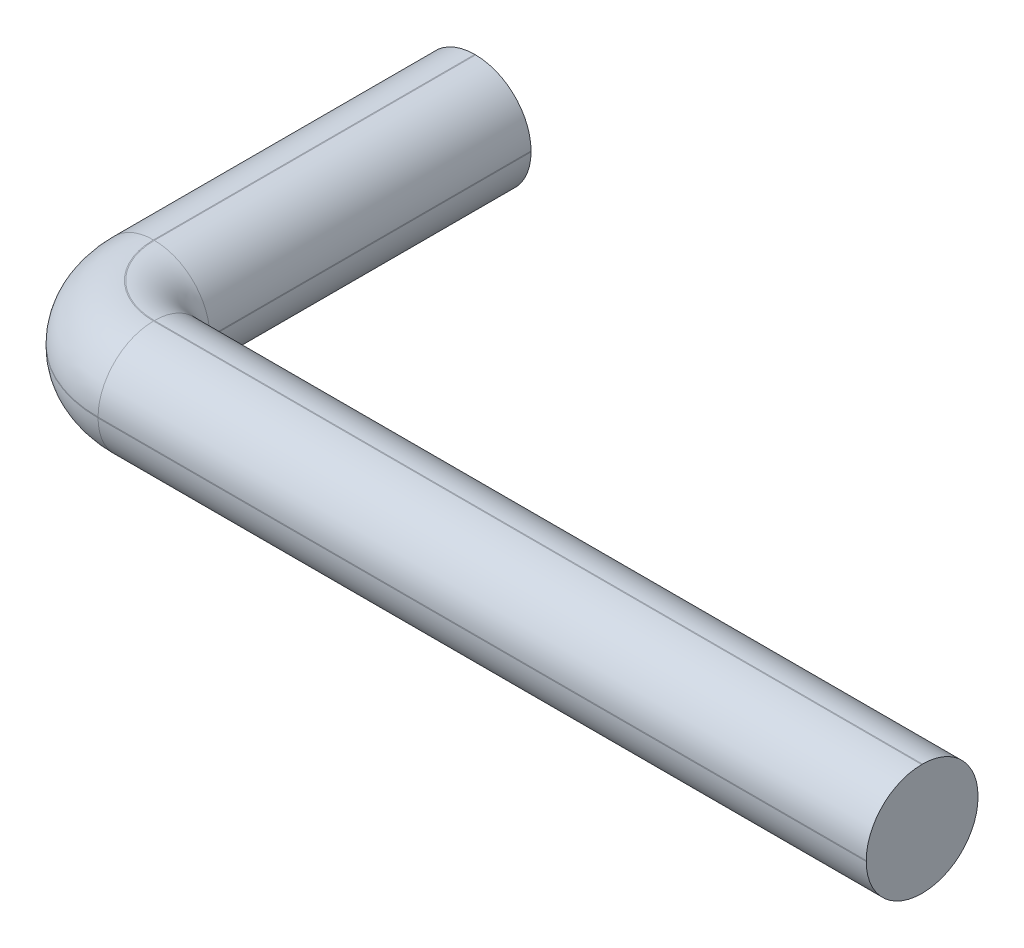
ISO-10303-21;
HEADER;
FILE_DESCRIPTION(('STEP AP214'),'2;1');
FILE_NAME('part.step','',(''),(''),'','','');
FILE_SCHEMA(('AUTOMOTIVE_DESIGN { 1 0 10303 214 1 1 1 1 }'));
ENDSEC;
DATA;
#1=APPLICATION_CONTEXT('core data for automotive mechanical design processes');
#2=APPLICATION_PROTOCOL_DEFINITION('international standard','automotive_design',2000,#1);
#3=PRODUCT_CONTEXT('',#1,'mechanical');
#4=PRODUCT('Part','Part','',(#3));
#5=PRODUCT_RELATED_PRODUCT_CATEGORY('part','',(#4));
#6=PRODUCT_DEFINITION_FORMATION('','',#4);
#7=PRODUCT_DEFINITION_CONTEXT('part definition',#1,'design');
#8=PRODUCT_DEFINITION('design','',#6,#7);
#9=PRODUCT_DEFINITION_SHAPE('','',#8);
#10=(LENGTH_UNIT() NAMED_UNIT(*) SI_UNIT(.MILLI.,.METRE.));
#11=(NAMED_UNIT(*) PLANE_ANGLE_UNIT() SI_UNIT($,.RADIAN.));
#12=(NAMED_UNIT(*) SI_UNIT($,.STERADIAN.) SOLID_ANGLE_UNIT());
#13=UNCERTAINTY_MEASURE_WITH_UNIT(LENGTH_MEASURE(1.E-05),#10,'distance_accuracy_value','');
#14=(GEOMETRIC_REPRESENTATION_CONTEXT(3) GLOBAL_UNCERTAINTY_ASSIGNED_CONTEXT((#13)) GLOBAL_UNIT_ASSIGNED_CONTEXT((#10,
#11,#12)) REPRESENTATION_CONTEXT('',''));
#15=CARTESIAN_POINT('',(0.,0.,0.));
#16=DIRECTION('',(0.,0.,1.));
#17=DIRECTION('',(1.,0.,0.));
#18=AXIS2_PLACEMENT_3D('',#15,#16,#17);
#19=CARTESIAN_POINT('',(3.1496,3.2004,0.));
#20=DIRECTION('',(0.,0.,1.));
#21=DIRECTION('',(1.,0.,0.));
#22=AXIS2_PLACEMENT_3D('',#19,#20,#21);
#23=CYLINDRICAL_SURFACE('',#22,3.1496);
#24=CARTESIAN_POINT('',(3.1496,3.2004,-7.14375));
#25=DIRECTION('',(0.,0.,-1.));
#26=DIRECTION('',(-1.,0.,0.));
#27=AXIS2_PLACEMENT_3D('',#24,#25,#26);
#28=CIRCLE('',#27,3.1496);
#29=CARTESIAN_POINT('',(3.1496,6.35,-7.14375));
#30=VERTEX_POINT('',#29);
#31=CARTESIAN_POINT('',(0.,3.2004,-7.14375));
#32=VERTEX_POINT('',#31);
#33=EDGE_CURVE('E170',#30,#32,#28,.F.);
#34=ORIENTED_EDGE('',*,*,#33,.F.);
#35=DIRECTION('',(0.,0.,-1.));
#36=VECTOR('',#35,1.);
#37=CARTESIAN_POINT('',(3.1496,6.35,0.));
#38=LINE('',#37,#36);
#39=CARTESIAN_POINT('',(3.1496,6.35,-25.4));
#40=VERTEX_POINT('',#39);
#41=EDGE_CURVE('E227',#30,#40,#38,.T.);
#42=ORIENTED_EDGE('',*,*,#41,.T.);
#43=CARTESIAN_POINT('',(3.1496,3.2004,-25.4));
#44=DIRECTION('',(0.,0.,1.));
#45=DIRECTION('',(1.,0.,0.));
#46=AXIS2_PLACEMENT_3D('',#43,#44,#45);
#47=CIRCLE('',#46,3.1496);
#48=CARTESIAN_POINT('',(0.,3.2004,-25.4));
#49=VERTEX_POINT('',#48);
#50=EDGE_CURVE('E166',#40,#49,#47,.T.);
#51=ORIENTED_EDGE('',*,*,#50,.T.);
#52=DIRECTION('',(0.,0.,-1.));
#53=VECTOR('',#52,1.);
#54=CARTESIAN_POINT('',(0.,3.2004,0.));
#55=LINE('',#54,#53);
#56=EDGE_CURVE('E150',#49,#32,#55,.F.);
#57=ORIENTED_EDGE('',*,*,#56,.T.);
#58=EDGE_LOOP('',(#34,#42,#51,#57));
#59=FACE_BOUND('',#58,.T.);
#60=ADVANCED_FACE('F17',(#59),#23,.T.);
#61=CARTESIAN_POINT('',(3.2004,3.2004,0.));
#62=DIRECTION('',(0.,0.,-1.));
#63=DIRECTION('',(-1.,0.,0.));
#64=AXIS2_PLACEMENT_3D('',#61,#62,#63);
#65=CYLINDRICAL_SURFACE('',#64,3.1496);
#66=CARTESIAN_POINT('',(3.2004,3.2004,-25.4));
#67=DIRECTION('',(0.,0.,-1.));
#68=DIRECTION('',(-1.,0.,0.));
#69=AXIS2_PLACEMENT_3D('',#66,#67,#68);
#70=CIRCLE('',#69,3.1496);
#71=CARTESIAN_POINT('',(6.35,3.2004,-25.4));
#72=VERTEX_POINT('',#71);
#73=CARTESIAN_POINT('',(3.2004,6.35,-25.4));
#74=VERTEX_POINT('',#73);
#75=EDGE_CURVE('E20',#72,#74,#70,.F.);
#76=ORIENTED_EDGE('',*,*,#75,.T.);
#77=DIRECTION('',(0.,0.,-1.));
#78=VECTOR('',#77,1.);
#79=CARTESIAN_POINT('',(3.2004,6.35,0.));
#80=LINE('',#79,#78);
#81=CARTESIAN_POINT('',(3.2004,6.35,-7.14375));
#82=VERTEX_POINT('',#81);
#83=EDGE_CURVE('E233',#74,#82,#80,.F.);
#84=ORIENTED_EDGE('',*,*,#83,.T.);
#85=CARTESIAN_POINT('',(3.2004,3.2004,-7.14375));
#86=DIRECTION('',(0.,0.,-1.));
#87=DIRECTION('',(-1.,0.,0.));
#88=AXIS2_PLACEMENT_3D('',#85,#86,#87);
#89=CIRCLE('',#88,3.1496);
#90=CARTESIAN_POINT('',(6.35,3.2004,-7.14375));
#91=VERTEX_POINT('',#90);
#92=EDGE_CURVE('E133',#91,#82,#89,.F.);
#93=ORIENTED_EDGE('',*,*,#92,.F.);
#94=DIRECTION('',(0.,0.,1.));
#95=VECTOR('',#94,1.);
#96=CARTESIAN_POINT('',(6.35,3.2004,-25.4));
#97=LINE('',#96,#95);
#98=EDGE_CURVE('E128',#91,#72,#97,.F.);
#99=ORIENTED_EDGE('',*,*,#98,.T.);
#100=EDGE_LOOP('',(#76,#84,#93,#99));
#101=FACE_BOUND('',#100,.T.);
#102=ADVANCED_FACE('F130',(#101),#65,.T.);
#103=CARTESIAN_POINT('',(7.14375,3.2004,-7.14375));
#104=DIRECTION('',(0.,-1.,0.));
#105=DIRECTION('',(0.,0.,-1.));
#106=AXIS2_PLACEMENT_3D('',#103,#104,#105);
#107=TOROIDAL_SURFACE('',#106,3.94335,3.1496);
#108=ORIENTED_EDGE('',*,*,#92,.T.);
#109=CARTESIAN_POINT('',(7.14375,6.35,-7.14375));
#110=DIRECTION('',(0.,1.,0.));
#111=DIRECTION('',(-1.,0.,0.));
#112=AXIS2_PLACEMENT_3D('',#109,#110,#111);
#113=CIRCLE('',#112,3.94335);
#114=CARTESIAN_POINT('',(7.14375,6.35,-3.2004));
#115=VERTEX_POINT('',#114);
#116=EDGE_CURVE('E200',#82,#115,#113,.T.);
#117=ORIENTED_EDGE('',*,*,#116,.T.);
#118=CARTESIAN_POINT('',(7.14375,3.2004,-3.2004));
#119=DIRECTION('',(-1.,0.,0.));
#120=DIRECTION('',(0.,0.,1.));
#121=AXIS2_PLACEMENT_3D('',#118,#119,#120);
#122=CIRCLE('',#121,3.1496);
#123=CARTESIAN_POINT('',(7.14375,3.2004,-6.35));
#124=VERTEX_POINT('',#123);
#125=EDGE_CURVE('E237',#124,#115,#122,.F.);
#126=ORIENTED_EDGE('',*,*,#125,.F.);
#127=CARTESIAN_POINT('',(7.14375,3.2004,-7.14375));
#128=DIRECTION('',(0.,1.,0.));
#129=DIRECTION('',(0.,0.,1.));
#130=AXIS2_PLACEMENT_3D('',#127,#128,#129);
#131=CIRCLE('',#130,0.79375);
#132=EDGE_CURVE('E155',#124,#91,#131,.F.);
#133=ORIENTED_EDGE('',*,*,#132,.T.);
#134=EDGE_LOOP('',(#108,#117,#126,#133));
#135=FACE_BOUND('',#134,.T.);
#136=ADVANCED_FACE('F207',(#135),#107,.T.);
#137=CARTESIAN_POINT('',(0.,6.35,0.));
#138=DIRECTION('',(0.,-1.,0.));
#139=DIRECTION('',(0.,0.,-1.));
#140=AXIS2_PLACEMENT_3D('',#137,#138,#139);
#141=PLANE('',#140);
#142=ORIENTED_EDGE('',*,*,#83,.F.);
#143=DIRECTION('',(1.,0.,0.));
#144=VECTOR('',#143,1.);
#145=CARTESIAN_POINT('',(0.,6.35,-25.4));
#146=LINE('',#145,#144);
#147=EDGE_CURVE('E149',#74,#40,#146,.F.);
#148=ORIENTED_EDGE('',*,*,#147,.T.);
#149=ORIENTED_EDGE('',*,*,#41,.F.);
#150=CARTESIAN_POINT('',(7.14375,6.35,-7.14375));
#151=DIRECTION('',(0.,-1.,0.));
#152=DIRECTION('',(0.,0.,1.));
#153=AXIS2_PLACEMENT_3D('',#150,#151,#152);
#154=CIRCLE('',#153,3.99415);
#155=CARTESIAN_POINT('',(7.14375,6.35,-3.1496));
#156=VERTEX_POINT('',#155);
#157=EDGE_CURVE('E300',#156,#30,#154,.T.);
#158=ORIENTED_EDGE('',*,*,#157,.F.);
#159=DIRECTION('',(1.,0.,0.));
#160=VECTOR('',#159,1.);
#161=CARTESIAN_POINT('',(0.,6.35,-3.1496));
#162=LINE('',#161,#160);
#163=CARTESIAN_POINT('',(50.8,6.35,-3.1496));
#164=VERTEX_POINT('',#163);
#165=EDGE_CURVE('E257',#164,#156,#162,.F.);
#166=ORIENTED_EDGE('',*,*,#165,.F.);
#167=DIRECTION('',(0.,0.,-1.));
#168=VECTOR('',#167,1.);
#169=CARTESIAN_POINT('',(50.8,6.35,0.));
#170=LINE('',#169,#168);
#171=CARTESIAN_POINT('',(50.8,6.35,-3.2004));
#172=VERTEX_POINT('',#171);
#173=EDGE_CURVE('E225',#172,#164,#170,.F.);
#174=ORIENTED_EDGE('',*,*,#173,.F.);
#175=DIRECTION('',(-1.,0.,0.));
#176=VECTOR('',#175,1.);
#177=CARTESIAN_POINT('',(0.,6.35,-3.2004));
#178=LINE('',#177,#176);
#179=EDGE_CURVE('E239',#115,#172,#178,.F.);
#180=ORIENTED_EDGE('',*,*,#179,.F.);
#181=ORIENTED_EDGE('',*,*,#116,.F.);
#182=EDGE_LOOP('',(#142,#148,#149,#158,#166,#174,#180,#181));
#183=FACE_BOUND('',#182,.T.);
#184=ADVANCED_FACE('F179',(#183),#141,.F.);
#185=CARTESIAN_POINT('',(7.14375,3.2004,-7.14375));
#186=DIRECTION('',(0.,-1.,0.));
#187=DIRECTION('',(0.,0.,-1.));
#188=AXIS2_PLACEMENT_3D('',#185,#186,#187);
#189=TOROIDAL_SURFACE('',#188,3.99415,3.1496);
#190=CARTESIAN_POINT('',(7.14375,3.2004,-3.1496));
#191=DIRECTION('',(1.,0.,0.));
#192=DIRECTION('',(0.,0.,-1.));
#193=AXIS2_PLACEMENT_3D('',#190,#191,#192);
#194=CIRCLE('',#193,3.1496);
#195=CARTESIAN_POINT('',(7.14375,3.2004,0.));
#196=VERTEX_POINT('',#195);
#197=EDGE_CURVE('E244',#156,#196,#194,.T.);
#198=ORIENTED_EDGE('',*,*,#197,.F.);
#199=ORIENTED_EDGE('',*,*,#157,.T.);
#200=ORIENTED_EDGE('',*,*,#33,.T.);
#201=CARTESIAN_POINT('',(7.14375,3.2004,-7.14375));
#202=DIRECTION('',(0.,-1.,0.));
#203=DIRECTION('',(0.,0.,-1.));
#204=AXIS2_PLACEMENT_3D('',#201,#202,#203);
#205=CIRCLE('',#204,7.14375);
#206=EDGE_CURVE('E291',#196,#32,#205,.T.);
#207=ORIENTED_EDGE('',*,*,#206,.F.);
#208=EDGE_LOOP('',(#198,#199,#200,#207));
#209=FACE_BOUND('',#208,.T.);
#210=ADVANCED_FACE('F173',(#209),#189,.T.);
#211=CARTESIAN_POINT('',(0.,6.35,0.));
#212=DIRECTION('',(1.,0.,0.));
#213=DIRECTION('',(0.,0.,-1.));
#214=AXIS2_PLACEMENT_3D('',#211,#212,#213);
#215=PLANE('',#214);
#216=DIRECTION('',(0.,0.,-1.));
#217=VECTOR('',#216,1.);
#218=CARTESIAN_POINT('',(0.,3.1496,0.));
#219=LINE('',#218,#217);
#220=CARTESIAN_POINT('',(0.,3.1496,-7.14375));
#221=VERTEX_POINT('',#220);
#222=CARTESIAN_POINT('',(0.,3.1496,-25.4));
#223=VERTEX_POINT('',#222);
#224=EDGE_CURVE('E280',#221,#223,#219,.T.);
#225=ORIENTED_EDGE('',*,*,#224,.F.);
#226=DIRECTION('',(0.,-1.,0.));
#227=VECTOR('',#226,1.);
#228=CARTESIAN_POINT('',(0.,6.35,-7.14375));
#229=LINE('',#228,#227);
#230=EDGE_CURVE('E260',#32,#221,#229,.T.);
#231=ORIENTED_EDGE('',*,*,#230,.F.);
#232=ORIENTED_EDGE('',*,*,#56,.F.);
#233=DIRECTION('',(0.,1.,0.));
#234=VECTOR('',#233,1.);
#235=CARTESIAN_POINT('',(0.,6.35,-25.4));
#236=LINE('',#235,#234);
#237=EDGE_CURVE('E164',#49,#223,#236,.F.);
#238=ORIENTED_EDGE('',*,*,#237,.T.);
#239=EDGE_LOOP('',(#225,#231,#232,#238));
#240=FACE_BOUND('',#239,.T.);
#241=ADVANCED_FACE('F178',(#240),#215,.F.);
#242=CARTESIAN_POINT('',(0.,6.35,-25.4));
#243=DIRECTION('',(0.,0.,1.));
#244=DIRECTION('',(1.,0.,0.));
#245=AXIS2_PLACEMENT_3D('',#242,#243,#244);
#246=PLANE('',#245);
#247=CARTESIAN_POINT('',(3.1496,3.1496,-25.4));
#248=DIRECTION('',(0.,0.,-1.));
#249=DIRECTION('',(-1.,0.,0.));
#250=AXIS2_PLACEMENT_3D('',#247,#248,#249);
#251=CIRCLE('',#250,3.1496);
#252=CARTESIAN_POINT('',(3.1496,0.,-25.4));
#253=VERTEX_POINT('',#252);
#254=EDGE_CURVE('E284',#223,#253,#251,.F.);
#255=ORIENTED_EDGE('',*,*,#254,.F.);
#256=ORIENTED_EDGE('',*,*,#237,.F.);
#257=ORIENTED_EDGE('',*,*,#50,.F.);
#258=ORIENTED_EDGE('',*,*,#147,.F.);
#259=ORIENTED_EDGE('',*,*,#75,.F.);
#260=DIRECTION('',(0.,1.,0.));
#261=VECTOR('',#260,1.);
#262=CARTESIAN_POINT('',(6.35,6.35,-25.4));
#263=LINE('',#262,#261);
#264=CARTESIAN_POINT('',(6.35,3.1496,-25.4));
#265=VERTEX_POINT('',#264);
#266=EDGE_CURVE('E138',#72,#265,#263,.F.);
#267=ORIENTED_EDGE('',*,*,#266,.T.);
#268=CARTESIAN_POINT('',(3.2004,3.1496,-25.4));
#269=DIRECTION('',(0.,0.,1.));
#270=DIRECTION('',(1.,0.,0.));
#271=AXIS2_PLACEMENT_3D('',#268,#269,#270);
#272=CIRCLE('',#271,3.1496);
#273=CARTESIAN_POINT('',(3.2004,0.,-25.4));
#274=VERTEX_POINT('',#273);
#275=EDGE_CURVE('E275',#274,#265,#272,.T.);
#276=ORIENTED_EDGE('',*,*,#275,.F.);
#277=DIRECTION('',(1.,0.,0.));
#278=VECTOR('',#277,1.);
#279=CARTESIAN_POINT('',(0.,0.,-25.4));
#280=LINE('',#279,#278);
#281=EDGE_CURVE('E139',#253,#274,#280,.T.);
#282=ORIENTED_EDGE('',*,*,#281,.F.);
#283=EDGE_LOOP('',(#255,#256,#257,#258,#259,#267,#276,#282));
#284=FACE_BOUND('',#283,.T.);
#285=ADVANCED_FACE('F144',(#284),#246,.F.);
#286=CARTESIAN_POINT('',(6.35,6.35,-25.4));
#287=DIRECTION('',(-1.,0.,0.));
#288=DIRECTION('',(0.,0.,1.));
#289=AXIS2_PLACEMENT_3D('',#286,#287,#288);
#290=PLANE('',#289);
#291=ORIENTED_EDGE('',*,*,#98,.F.);
#292=DIRECTION('',(0.,1.,0.));
#293=VECTOR('',#292,1.);
#294=CARTESIAN_POINT('',(6.35,6.35,-7.14375));
#295=LINE('',#294,#293);
#296=CARTESIAN_POINT('',(6.35,3.1496,-7.14375));
#297=VERTEX_POINT('',#296);
#298=EDGE_CURVE('E157',#91,#297,#295,.F.);
#299=ORIENTED_EDGE('',*,*,#298,.T.);
#300=DIRECTION('',(0.,0.,1.));
#301=VECTOR('',#300,1.);
#302=CARTESIAN_POINT('',(6.35,3.1496,-25.4));
#303=LINE('',#302,#301);
#304=EDGE_CURVE('E153',#265,#297,#303,.T.);
#305=ORIENTED_EDGE('',*,*,#304,.F.);
#306=ORIENTED_EDGE('',*,*,#266,.F.);
#307=EDGE_LOOP('',(#291,#299,#305,#306));
#308=FACE_BOUND('',#307,.T.);
#309=ADVANCED_FACE('F151',(#308),#290,.F.);
#310=CARTESIAN_POINT('',(7.14375,6.35,-7.14375));
#311=DIRECTION('',(0.,1.,0.));
#312=DIRECTION('',(0.,0.,1.));
#313=AXIS2_PLACEMENT_3D('',#310,#311,#312);
#314=CYLINDRICAL_SURFACE('',#313,0.79375);
#315=CARTESIAN_POINT('',(7.14375,3.1496,-7.14375));
#316=DIRECTION('',(0.,-1.,0.));
#317=DIRECTION('',(0.,0.,-1.));
#318=AXIS2_PLACEMENT_3D('',#315,#316,#317);
#319=CIRCLE('',#318,0.793749999999999);
#320=CARTESIAN_POINT('',(7.14375,3.1496,-6.35));
#321=VERTEX_POINT('',#320);
#322=EDGE_CURVE('E266',#297,#321,#319,.F.);
#323=ORIENTED_EDGE('',*,*,#322,.F.);
#324=ORIENTED_EDGE('',*,*,#298,.F.);
#325=ORIENTED_EDGE('',*,*,#132,.F.);
#326=DIRECTION('',(0.,1.,0.));
#327=VECTOR('',#326,1.);
#328=CARTESIAN_POINT('',(7.14375,6.35,-6.35));
#329=LINE('',#328,#327);
#330=EDGE_CURVE('E250',#124,#321,#329,.F.);
#331=ORIENTED_EDGE('',*,*,#330,.T.);
#332=EDGE_LOOP('',(#323,#324,#325,#331));
#333=FACE_BOUND('',#332,.T.);
#334=ADVANCED_FACE('F418',(#333),#314,.F.);
#335=CARTESIAN_POINT('',(6.35,6.35,-6.35));
#336=DIRECTION('',(0.,0.,1.));
#337=DIRECTION('',(1.,0.,0.));
#338=AXIS2_PLACEMENT_3D('',#335,#336,#337);
#339=PLANE('',#338);
#340=DIRECTION('',(1.,0.,0.));
#341=VECTOR('',#340,1.);
#342=CARTESIAN_POINT('',(6.35,3.1496,-6.35));
#343=LINE('',#342,#341);
#344=CARTESIAN_POINT('',(50.8,3.1496,-6.35));
#345=VERTEX_POINT('',#344);
#346=EDGE_CURVE('E334',#321,#345,#343,.T.);
#347=ORIENTED_EDGE('',*,*,#346,.F.);
#348=ORIENTED_EDGE('',*,*,#330,.F.);
#349=DIRECTION('',(-1.,0.,0.));
#350=VECTOR('',#349,1.);
#351=CARTESIAN_POINT('',(0.,3.2004,-6.35));
#352=LINE('',#351,#350);
#353=CARTESIAN_POINT('',(50.8,3.2004,-6.35));
#354=VERTEX_POINT('',#353);
#355=EDGE_CURVE('E240',#354,#124,#352,.T.);
#356=ORIENTED_EDGE('',*,*,#355,.F.);
#357=DIRECTION('',(0.,1.,0.));
#358=VECTOR('',#357,1.);
#359=CARTESIAN_POINT('',(50.8,6.35,-6.35));
#360=LINE('',#359,#358);
#361=EDGE_CURVE('E246',#345,#354,#360,.T.);
#362=ORIENTED_EDGE('',*,*,#361,.F.);
#363=EDGE_LOOP('',(#347,#348,#356,#362));
#364=FACE_BOUND('',#363,.T.);
#365=ADVANCED_FACE('F416',(#364),#339,.F.);
#366=CARTESIAN_POINT('',(0.,3.2004,-3.2004));
#367=DIRECTION('',(-1.,0.,0.));
#368=DIRECTION('',(0.,0.,1.));
#369=AXIS2_PLACEMENT_3D('',#366,#367,#368);
#370=CYLINDRICAL_SURFACE('',#369,3.1496);
#371=ORIENTED_EDGE('',*,*,#125,.T.);
#372=ORIENTED_EDGE('',*,*,#179,.T.);
#373=CARTESIAN_POINT('',(50.8,3.2004,-3.2004));
#374=DIRECTION('',(-1.,0.,0.));
#375=DIRECTION('',(0.,0.,1.));
#376=AXIS2_PLACEMENT_3D('',#373,#374,#375);
#377=CIRCLE('',#376,3.1496);
#378=EDGE_CURVE('E343',#172,#354,#377,.T.);
#379=ORIENTED_EDGE('',*,*,#378,.T.);
#380=ORIENTED_EDGE('',*,*,#355,.T.);
#381=EDGE_LOOP('',(#371,#372,#379,#380));
#382=FACE_BOUND('',#381,.T.);
#383=ADVANCED_FACE('F412',(#382),#370,.T.);
#384=CARTESIAN_POINT('',(0.,3.2004,-3.1496));
#385=DIRECTION('',(1.,0.,0.));
#386=DIRECTION('',(0.,0.,-1.));
#387=AXIS2_PLACEMENT_3D('',#384,#385,#386);
#388=CYLINDRICAL_SURFACE('',#387,3.1496);
#389=CARTESIAN_POINT('',(50.8,3.2004,-3.1496));
#390=DIRECTION('',(1.,0.,0.));
#391=DIRECTION('',(0.,0.,-1.));
#392=AXIS2_PLACEMENT_3D('',#389,#390,#391);
#393=CIRCLE('',#392,3.1496);
#394=CARTESIAN_POINT('',(50.8,3.2004,0.));
#395=VERTEX_POINT('',#394);
#396=EDGE_CURVE('E288',#395,#164,#393,.F.);
#397=ORIENTED_EDGE('',*,*,#396,.T.);
#398=ORIENTED_EDGE('',*,*,#165,.T.);
#399=ORIENTED_EDGE('',*,*,#197,.T.);
#400=DIRECTION('',(-1.,0.,0.));
#401=VECTOR('',#400,1.);
#402=CARTESIAN_POINT('',(50.8,3.2004,0.));
#403=LINE('',#402,#401);
#404=EDGE_CURVE('E322',#196,#395,#403,.F.);
#405=ORIENTED_EDGE('',*,*,#404,.T.);
#406=EDGE_LOOP('',(#397,#398,#399,#405));
#407=FACE_BOUND('',#406,.T.);
#408=ADVANCED_FACE('F468',(#407),#388,.T.);
#409=CARTESIAN_POINT('',(7.14375,6.35,-7.14375));
#410=DIRECTION('',(0.,-1.,0.));
#411=DIRECTION('',(0.,0.,-1.));
#412=AXIS2_PLACEMENT_3D('',#409,#410,#411);
#413=CYLINDRICAL_SURFACE('',#412,7.14375);
#414=DIRECTION('',(0.,1.,0.));
#415=VECTOR('',#414,1.);
#416=CARTESIAN_POINT('',(7.14375,6.35,0.));
#417=LINE('',#416,#415);
#418=CARTESIAN_POINT('',(7.14375,3.1496,0.));
#419=VERTEX_POINT('',#418);
#420=EDGE_CURVE('E325',#419,#196,#417,.T.);
#421=ORIENTED_EDGE('',*,*,#420,.T.);
#422=ORIENTED_EDGE('',*,*,#206,.T.);
#423=ORIENTED_EDGE('',*,*,#230,.T.);
#424=CARTESIAN_POINT('',(7.14375,3.1496,-7.14375));
#425=DIRECTION('',(0.,-1.,0.));
#426=DIRECTION('',(0.,0.,-1.));
#427=AXIS2_PLACEMENT_3D('',#424,#425,#426);
#428=CIRCLE('',#427,7.14375);
#429=EDGE_CURVE('E313',#419,#221,#428,.T.);
#430=ORIENTED_EDGE('',*,*,#429,.F.);
#431=EDGE_LOOP('',(#421,#422,#423,#430));
#432=FACE_BOUND('',#431,.T.);
#433=ADVANCED_FACE('F312',(#432),#413,.T.);
#434=CARTESIAN_POINT('',(3.1496,3.1496,0.));
#435=DIRECTION('',(0.,0.,-1.));
#436=DIRECTION('',(-1.,0.,0.));
#437=AXIS2_PLACEMENT_3D('',#434,#435,#436);
#438=CYLINDRICAL_SURFACE('',#437,3.1496);
#439=CARTESIAN_POINT('',(3.1496,3.1496,-7.14375));
#440=DIRECTION('',(0.,0.,-1.));
#441=DIRECTION('',(-1.,0.,0.));
#442=AXIS2_PLACEMENT_3D('',#439,#440,#441);
#443=CIRCLE('',#442,3.1496);
#444=CARTESIAN_POINT('',(3.1496,0.,-7.14375));
#445=VERTEX_POINT('',#444);
#446=EDGE_CURVE('E307',#221,#445,#443,.F.);
#447=ORIENTED_EDGE('',*,*,#446,.F.);
#448=ORIENTED_EDGE('',*,*,#224,.T.);
#449=ORIENTED_EDGE('',*,*,#254,.T.);
#450=DIRECTION('',(0.,0.,-1.));
#451=VECTOR('',#450,1.);
#452=CARTESIAN_POINT('',(3.1496,0.,0.));
#453=LINE('',#452,#451);
#454=EDGE_CURVE('E424',#445,#253,#453,.T.);
#455=ORIENTED_EDGE('',*,*,#454,.F.);
#456=EDGE_LOOP('',(#447,#448,#449,#455));
#457=FACE_BOUND('',#456,.T.);
#458=ADVANCED_FACE('F306',(#457),#438,.T.);
#459=CARTESIAN_POINT('',(3.2004,3.1496,-25.4));
#460=DIRECTION('',(0.,0.,1.));
#461=DIRECTION('',(1.,0.,0.));
#462=AXIS2_PLACEMENT_3D('',#459,#460,#461);
#463=CYLINDRICAL_SURFACE('',#462,3.1496);
#464=CARTESIAN_POINT('',(3.2004,3.1496,-7.14375));
#465=DIRECTION('',(0.,0.,-1.));
#466=DIRECTION('',(-1.,0.,0.));
#467=AXIS2_PLACEMENT_3D('',#464,#465,#466);
#468=CIRCLE('',#467,3.1496);
#469=CARTESIAN_POINT('',(3.2004,0.,-7.14375));
#470=VERTEX_POINT('',#469);
#471=EDGE_CURVE('E270',#470,#297,#468,.F.);
#472=ORIENTED_EDGE('',*,*,#471,.F.);
#473=DIRECTION('',(0.,0.,-1.));
#474=VECTOR('',#473,1.);
#475=CARTESIAN_POINT('',(3.2004,0.,0.));
#476=LINE('',#475,#474);
#477=EDGE_CURVE('E422',#274,#470,#476,.F.);
#478=ORIENTED_EDGE('',*,*,#477,.F.);
#479=ORIENTED_EDGE('',*,*,#275,.T.);
#480=ORIENTED_EDGE('',*,*,#304,.T.);
#481=EDGE_LOOP('',(#472,#478,#479,#480));
#482=FACE_BOUND('',#481,.T.);
#483=ADVANCED_FACE('F362',(#482),#463,.T.);
#484=CARTESIAN_POINT('',(7.14375,3.1496,-7.14375));
#485=DIRECTION('',(0.,-1.,0.));
#486=DIRECTION('',(0.,0.,-1.));
#487=AXIS2_PLACEMENT_3D('',#484,#485,#486);
#488=TOROIDAL_SURFACE('',#487,3.94335,3.1496);
#489=CARTESIAN_POINT('',(7.14375,3.1496,-3.2004));
#490=DIRECTION('',(1.,0.,0.));
#491=DIRECTION('',(0.,0.,-1.));
#492=AXIS2_PLACEMENT_3D('',#489,#490,#491);
#493=CIRCLE('',#492,3.1496);
#494=CARTESIAN_POINT('',(7.14375,0.,-3.2004));
#495=VERTEX_POINT('',#494);
#496=EDGE_CURVE('E269',#495,#321,#493,.T.);
#497=ORIENTED_EDGE('',*,*,#496,.F.);
#498=CARTESIAN_POINT('',(7.14375,0.,-7.14375));
#499=DIRECTION('',(0.,-1.,0.));
#500=DIRECTION('',(0.,0.,1.));
#501=AXIS2_PLACEMENT_3D('',#498,#499,#500);
#502=CIRCLE('',#501,3.94335);
#503=EDGE_CURVE('E420',#470,#495,#502,.F.);
#504=ORIENTED_EDGE('',*,*,#503,.F.);
#505=ORIENTED_EDGE('',*,*,#471,.T.);
#506=ORIENTED_EDGE('',*,*,#322,.T.);
#507=EDGE_LOOP('',(#497,#504,#505,#506));
#508=FACE_BOUND('',#507,.T.);
#509=ADVANCED_FACE('F356',(#508),#488,.T.);
#510=CARTESIAN_POINT('',(6.35,3.1496,-3.2004));
#511=DIRECTION('',(1.,0.,0.));
#512=DIRECTION('',(0.,0.,-1.));
#513=AXIS2_PLACEMENT_3D('',#510,#511,#512);
#514=CYLINDRICAL_SURFACE('',#513,3.1496);
#515=ORIENTED_EDGE('',*,*,#496,.T.);
#516=ORIENTED_EDGE('',*,*,#346,.T.);
#517=CARTESIAN_POINT('',(50.8,3.1496,-3.2004));
#518=DIRECTION('',(1.,0.,0.));
#519=DIRECTION('',(0.,0.,-1.));
#520=AXIS2_PLACEMENT_3D('',#517,#518,#519);
#521=CIRCLE('',#520,3.1496);
#522=CARTESIAN_POINT('',(50.8,0.,-3.2004));
#523=VERTEX_POINT('',#522);
#524=EDGE_CURVE('E409',#345,#523,#521,.F.);
#525=ORIENTED_EDGE('',*,*,#524,.T.);
#526=DIRECTION('',(1.,0.,0.));
#527=VECTOR('',#526,1.);
#528=CARTESIAN_POINT('',(0.,0.,-3.2004));
#529=LINE('',#528,#527);
#530=EDGE_CURVE('E426',#495,#523,#529,.T.);
#531=ORIENTED_EDGE('',*,*,#530,.F.);
#532=EDGE_LOOP('',(#515,#516,#525,#531));
#533=FACE_BOUND('',#532,.T.);
#534=ADVANCED_FACE('F361',(#533),#514,.T.);
#535=CARTESIAN_POINT('',(50.8,6.35,-6.35));
#536=DIRECTION('',(-1.,0.,0.));
#537=DIRECTION('',(0.,0.,1.));
#538=AXIS2_PLACEMENT_3D('',#535,#536,#537);
#539=PLANE('',#538);
#540=ORIENTED_EDGE('',*,*,#524,.F.);
#541=ORIENTED_EDGE('',*,*,#361,.T.);
#542=ORIENTED_EDGE('',*,*,#378,.F.);
#543=ORIENTED_EDGE('',*,*,#173,.T.);
#544=ORIENTED_EDGE('',*,*,#396,.F.);
#545=DIRECTION('',(0.,1.,0.));
#546=VECTOR('',#545,1.);
#547=CARTESIAN_POINT('',(50.8,6.35,0.));
#548=LINE('',#547,#546);
#549=CARTESIAN_POINT('',(50.8,3.1496,0.));
#550=VERTEX_POINT('',#549);
#551=EDGE_CURVE('E324',#395,#550,#548,.F.);
#552=ORIENTED_EDGE('',*,*,#551,.T.);
#553=CARTESIAN_POINT('',(50.8,3.1496,-3.1496));
#554=DIRECTION('',(-1.,0.,0.));
#555=DIRECTION('',(0.,0.,1.));
#556=AXIS2_PLACEMENT_3D('',#553,#554,#555);
#557=CIRCLE('',#556,3.1496);
#558=CARTESIAN_POINT('',(50.8,0.,-3.1496));
#559=VERTEX_POINT('',#558);
#560=EDGE_CURVE('E205',#559,#550,#557,.T.);
#561=ORIENTED_EDGE('',*,*,#560,.F.);
#562=DIRECTION('',(0.,0.,-1.));
#563=VECTOR('',#562,1.);
#564=CARTESIAN_POINT('',(50.8,0.,0.));
#565=LINE('',#564,#563);
#566=EDGE_CURVE('E399',#523,#559,#565,.F.);
#567=ORIENTED_EDGE('',*,*,#566,.F.);
#568=EDGE_LOOP('',(#540,#541,#542,#543,#544,#552,#561,#567));
#569=FACE_BOUND('',#568,.T.);
#570=ADVANCED_FACE('F413',(#569),#539,.F.);
#571=CARTESIAN_POINT('',(50.8,6.35,0.));
#572=DIRECTION('',(0.,0.,-1.));
#573=DIRECTION('',(-1.,0.,0.));
#574=AXIS2_PLACEMENT_3D('',#571,#572,#573);
#575=PLANE('',#574);
#576=ORIENTED_EDGE('',*,*,#404,.F.);
#577=ORIENTED_EDGE('',*,*,#420,.F.);
#578=DIRECTION('',(-1.,0.,0.));
#579=VECTOR('',#578,1.);
#580=CARTESIAN_POINT('',(50.8,3.1496,0.));
#581=LINE('',#580,#579);
#582=EDGE_CURVE('E404',#550,#419,#581,.T.);
#583=ORIENTED_EDGE('',*,*,#582,.F.);
#584=ORIENTED_EDGE('',*,*,#551,.F.);
#585=EDGE_LOOP('',(#576,#577,#583,#584));
#586=FACE_BOUND('',#585,.T.);
#587=ADVANCED_FACE('F393',(#586),#575,.F.);
#588=CARTESIAN_POINT('',(7.14375,3.1496,-7.14375));
#589=DIRECTION('',(0.,-1.,0.));
#590=DIRECTION('',(0.,0.,-1.));
#591=AXIS2_PLACEMENT_3D('',#588,#589,#590);
#592=TOROIDAL_SURFACE('',#591,3.99415,3.1496);
#593=ORIENTED_EDGE('',*,*,#446,.T.);
#594=CARTESIAN_POINT('',(7.14375,0.,-7.14375));
#595=DIRECTION('',(0.,1.,0.));
#596=DIRECTION('',(-1.,0.,0.));
#597=AXIS2_PLACEMENT_3D('',#594,#595,#596);
#598=CIRCLE('',#597,3.99415);
#599=CARTESIAN_POINT('',(7.14375,0.,-3.1496));
#600=VERTEX_POINT('',#599);
#601=EDGE_CURVE('E35',#600,#445,#598,.F.);
#602=ORIENTED_EDGE('',*,*,#601,.F.);
#603=CARTESIAN_POINT('',(7.14375,3.1496,-3.1496));
#604=DIRECTION('',(-1.,0.,0.));
#605=DIRECTION('',(0.,0.,1.));
#606=AXIS2_PLACEMENT_3D('',#603,#604,#605);
#607=CIRCLE('',#606,3.1496);
#608=EDGE_CURVE('E26',#419,#600,#607,.F.);
#609=ORIENTED_EDGE('',*,*,#608,.F.);
#610=ORIENTED_EDGE('',*,*,#429,.T.);
#611=EDGE_LOOP('',(#593,#602,#609,#610));
#612=FACE_BOUND('',#611,.T.);
#613=ADVANCED_FACE('F381',(#612),#592,.T.);
#614=CARTESIAN_POINT('',(0.,0.,0.));
#615=DIRECTION('',(0.,-1.,0.));
#616=DIRECTION('',(0.,0.,-1.));
#617=AXIS2_PLACEMENT_3D('',#614,#615,#616);
#618=PLANE('',#617);
#619=ORIENTED_EDGE('',*,*,#566,.T.);
#620=DIRECTION('',(-1.,0.,0.));
#621=VECTOR('',#620,1.);
#622=CARTESIAN_POINT('',(50.8,0.,-3.1496));
#623=LINE('',#622,#621);
#624=EDGE_CURVE('E11',#600,#559,#623,.F.);
#625=ORIENTED_EDGE('',*,*,#624,.F.);
#626=ORIENTED_EDGE('',*,*,#601,.T.);
#627=ORIENTED_EDGE('',*,*,#454,.T.);
#628=ORIENTED_EDGE('',*,*,#281,.T.);
#629=ORIENTED_EDGE('',*,*,#477,.T.);
#630=ORIENTED_EDGE('',*,*,#503,.T.);
#631=ORIENTED_EDGE('',*,*,#530,.T.);
#632=EDGE_LOOP('',(#619,#625,#626,#627,#628,#629,#630,#631));
#633=FACE_BOUND('',#632,.T.);
#634=ADVANCED_FACE('F392',(#633),#618,.T.);
#635=CARTESIAN_POINT('',(50.8,3.1496,-3.1496));
#636=DIRECTION('',(-1.,0.,0.));
#637=DIRECTION('',(0.,0.,1.));
#638=AXIS2_PLACEMENT_3D('',#635,#636,#637);
#639=CYLINDRICAL_SURFACE('',#638,3.1496);
#640=ORIENTED_EDGE('',*,*,#608,.T.);
#641=ORIENTED_EDGE('',*,*,#624,.T.);
#642=ORIENTED_EDGE('',*,*,#560,.T.);
#643=ORIENTED_EDGE('',*,*,#582,.T.);
#644=EDGE_LOOP('',(#640,#641,#642,#643));
#645=FACE_BOUND('',#644,.T.);
#646=ADVANCED_FACE('F441',(#645),#639,.T.);
#647=CLOSED_SHELL('',(#60,#102,#136,#184,#210,#241,#285,#309,#334,#365,#383,#408,#433,#458,#483,
#509,#534,#570,#587,#613,#634,#646));
#648=MANIFOLD_SOLID_BREP('B1',#647);
#649=ADVANCED_BREP_SHAPE_REPRESENTATION('',(#18,#648),#14);
#650=SHAPE_DEFINITION_REPRESENTATION(#9,#649);
ENDSEC;
END-ISO-10303-21;
